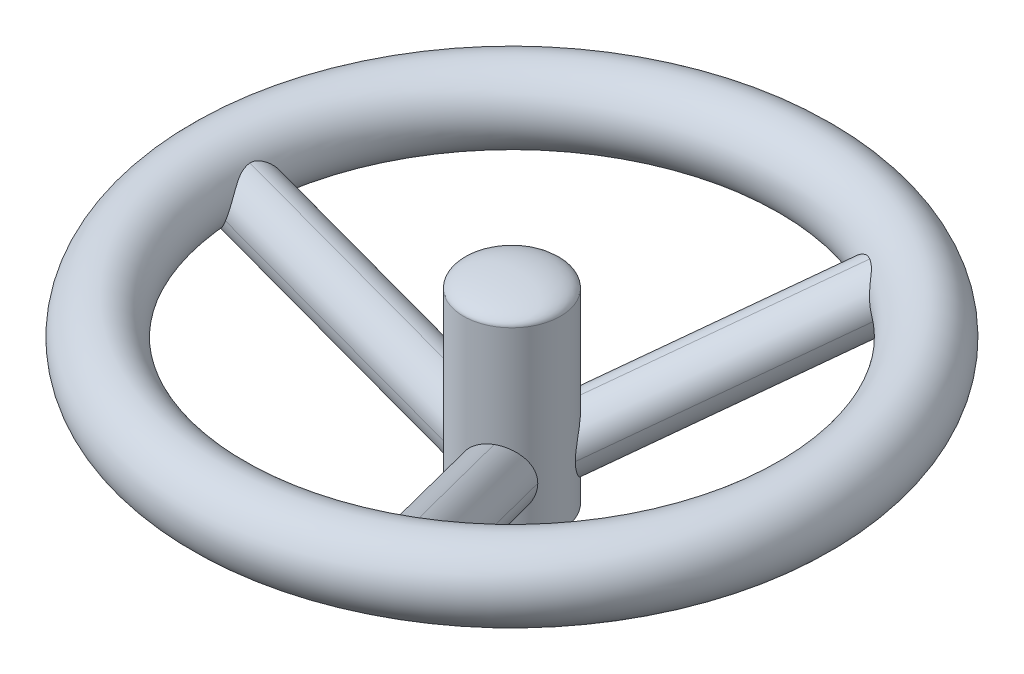
ISO-10303-21;
HEADER;
FILE_DESCRIPTION(('STEP AP214'),'2;1');
FILE_NAME('part.step','',(''),(''),'','','');
FILE_SCHEMA(('AUTOMOTIVE_DESIGN { 1 0 10303 214 1 1 1 1 }'));
ENDSEC;
DATA;
#1=APPLICATION_CONTEXT('core data for automotive mechanical design processes');
#2=APPLICATION_PROTOCOL_DEFINITION('international standard','automotive_design',2000,#1);
#3=PRODUCT_CONTEXT('',#1,'mechanical');
#4=PRODUCT('Part','Part','',(#3));
#5=PRODUCT_RELATED_PRODUCT_CATEGORY('part','',(#4));
#6=PRODUCT_DEFINITION_FORMATION('','',#4);
#7=PRODUCT_DEFINITION_CONTEXT('part definition',#1,'design');
#8=PRODUCT_DEFINITION('design','',#6,#7);
#9=PRODUCT_DEFINITION_SHAPE('','',#8);
#10=(LENGTH_UNIT() NAMED_UNIT(*) SI_UNIT(.MILLI.,.METRE.));
#11=(NAMED_UNIT(*) PLANE_ANGLE_UNIT() SI_UNIT($,.RADIAN.));
#12=(NAMED_UNIT(*) SI_UNIT($,.STERADIAN.) SOLID_ANGLE_UNIT());
#13=UNCERTAINTY_MEASURE_WITH_UNIT(LENGTH_MEASURE(1.E-05),#10,'distance_accuracy_value','');
#14=(GEOMETRIC_REPRESENTATION_CONTEXT(3) GLOBAL_UNCERTAINTY_ASSIGNED_CONTEXT((#13)) GLOBAL_UNIT_ASSIGNED_CONTEXT((#10,
#11,#12)) REPRESENTATION_CONTEXT('',''));
#15=CARTESIAN_POINT('',(0.,0.,0.));
#16=DIRECTION('',(0.,0.,1.));
#17=DIRECTION('',(1.,0.,0.));
#18=AXIS2_PLACEMENT_3D('',#15,#16,#17);
#19=CARTESIAN_POINT('',(79.1831013105577,18.7376895775405,177.149154570763));
#20=DIRECTION('',(0.468442239438506,0.349639061375189,0.811365759118855));
#21=DIRECTION('',(0.174819530687591,-0.936884478877026,0.302796309306261));
#22=AXIS2_PLACEMENT_3D('',#19,#20,#21);
#23=PLANE('',#22);
#24=CARTESIAN_POINT('',(99.9999999999984,0.,173.205080756889));
#25=DIRECTION('',(0.468442239438506,0.349639061375189,0.811365759118855));
#26=DIRECTION('',(0.174819530687591,-0.936884478877026,0.302796309306261));
#27=AXIS2_PLACEMENT_3D('',#24,#25,#26);
#28=CIRCLE('',#27,20.);
#29=CARTESIAN_POINT('',(117.320508075687,0.,163.205080756889));
#30=VERTEX_POINT('',#29);
#31=CARTESIAN_POINT('',(96.5036093862466,18.7376895775405,167.149154570763));
#32=VERTEX_POINT('',#31);
#33=EDGE_CURVE('E105',#30,#32,#28,.T.);
#34=ORIENTED_EDGE('',*,*,#33,.T.);
#35=CARTESIAN_POINT('',(99.9999999999984,0.,173.205080756889));
#36=DIRECTION('',(0.468442239438506,0.349639061375189,0.811365759118855));
#37=DIRECTION('',(0.174819530687591,-0.936884478877026,0.302796309306261));
#38=AXIS2_PLACEMENT_3D('',#35,#36,#37);
#39=CIRCLE('',#38,20.);
#40=CARTESIAN_POINT('',(82.6794919243095,0.,183.205080756889));
#41=VERTEX_POINT('',#40);
#42=EDGE_CURVE('E56',#32,#41,#39,.T.);
#43=ORIENTED_EDGE('',*,*,#42,.T.);
#44=CARTESIAN_POINT('',(99.9999999999984,0.,173.205080756889));
#45=DIRECTION('',(0.468442239438506,0.349639061375189,0.811365759118855));
#46=DIRECTION('',(0.174819530687591,-0.936884478877026,0.302796309306261));
#47=AXIS2_PLACEMENT_3D('',#44,#45,#46);
#48=CIRCLE('',#47,20.);
#49=CARTESIAN_POINT('',(103.49639061375,-18.7376895775405,179.261006943014));
#50=VERTEX_POINT('',#49);
#51=EDGE_CURVE('E103',#41,#50,#48,.T.);
#52=ORIENTED_EDGE('',*,*,#51,.T.);
#53=CARTESIAN_POINT('',(99.9999999999984,0.,173.205080756889));
#54=DIRECTION('',(0.468442239438506,0.349639061375189,0.811365759118855));
#55=DIRECTION('',(0.174819530687591,-0.936884478877026,0.302796309306261));
#56=AXIS2_PLACEMENT_3D('',#53,#54,#55);
#57=CIRCLE('',#56,20.);
#58=EDGE_CURVE('E69',#50,#30,#57,.T.);
#59=ORIENTED_EDGE('',*,*,#58,.T.);
#60=EDGE_LOOP('',(#34,#43,#52,#59));
#61=FACE_BOUND('',#60,.T.);
#62=ADVANCED_FACE('F48',(#61),#23,.T.);
#63=CARTESIAN_POINT('',(-14.6172712476637,-51.2736617839647,14.6821435310308));
#64=DIRECTION('',(-0.468442239438506,-0.349639061375189,-0.811365759118855));
#65=DIRECTION('',(-0.174819530687592,0.936884478877026,-0.302796309306262));
#66=AXIS2_PLACEMENT_3D('',#63,#64,#65);
#67=PLANE('',#66);
#68=CARTESIAN_POINT('',(6.19962744177695,-70.0113513615052,10.7380697171562));
#69=DIRECTION('',(-0.468442239438506,-0.349639061375189,-0.811365759118855));
#70=DIRECTION('',(-0.174819530687592,0.936884478877026,-0.302796309306262));
#71=AXIS2_PLACEMENT_3D('',#68,#69,#70);
#72=CIRCLE('',#71,20.);
#73=CARTESIAN_POINT('',(9.69601805552878,-88.7490409390457,16.7939959032814));
#74=VERTEX_POINT('',#73);
#75=CARTESIAN_POINT('',(-11.1208806339119,-70.0113513615052,20.738069717156));
#76=VERTEX_POINT('',#75);
#77=EDGE_CURVE('E92',#74,#76,#72,.T.);
#78=ORIENTED_EDGE('',*,*,#77,.T.);
#79=CARTESIAN_POINT('',(6.19962744177696,-70.0113513615052,10.7380697171562));
#80=DIRECTION('',(-0.468442239438506,-0.349639061375189,-0.811365759118855));
#81=DIRECTION('',(-0.174819530687592,0.936884478877026,-0.302796309306262));
#82=AXIS2_PLACEMENT_3D('',#79,#80,#81);
#83=CIRCLE('',#82,20.);
#84=CARTESIAN_POINT('',(2.70323682802512,-51.2736617839647,4.68214353103094));
#85=VERTEX_POINT('',#84);
#86=EDGE_CURVE('E12',#76,#85,#83,.T.);
#87=ORIENTED_EDGE('',*,*,#86,.T.);
#88=CARTESIAN_POINT('',(6.19962744177696,-70.0113513615052,10.7380697171562));
#89=DIRECTION('',(-0.468442239438506,-0.349639061375189,-0.811365759118855));
#90=DIRECTION('',(-0.174819530687592,0.936884478877026,-0.302796309306262));
#91=AXIS2_PLACEMENT_3D('',#88,#89,#90);
#92=CIRCLE('',#91,20.);
#93=CARTESIAN_POINT('',(23.5201355174658,-70.0113513615052,0.738069717156328));
#94=VERTEX_POINT('',#93);
#95=EDGE_CURVE('E89',#85,#94,#92,.T.);
#96=ORIENTED_EDGE('',*,*,#95,.T.);
#97=CARTESIAN_POINT('',(6.19962744177695,-70.0113513615052,10.7380697171562));
#98=DIRECTION('',(-0.468442239438506,-0.349639061375189,-0.811365759118855));
#99=DIRECTION('',(-0.174819530687592,0.936884478877026,-0.302796309306262));
#100=AXIS2_PLACEMENT_3D('',#97,#98,#99);
#101=CIRCLE('',#100,20.);
#102=EDGE_CURVE('E101',#94,#74,#101,.T.);
#103=ORIENTED_EDGE('',*,*,#102,.T.);
#104=EDGE_LOOP('',(#78,#87,#96,#103));
#105=FACE_BOUND('',#104,.T.);
#106=ADVANCED_FACE('F88',(#105),#67,.T.);
#107=CARTESIAN_POINT('',(12.2247473239321,-65.5142819623093,21.1738834747425));
#108=DIRECTION('',(0.468442239438506,0.349639061375189,0.811365759118854));
#109=DIRECTION('',(0.174819530687592,-0.936884478877026,0.302796309306262));
#110=AXIS2_PLACEMENT_3D('',#107,#108,#109);
#111=CYLINDRICAL_SURFACE('',#110,20.);
#112=DIRECTION('',(0.468442239438506,0.349639061375189,0.811365759118854));
#113=VECTOR('',#112,1.);
#114=CARTESIAN_POINT('',(96.5036093862466,18.7376895775405,167.149154570763));
#115=LINE('',#114,#113);
#116=EDGE_CURVE('E97',#32,#85,#115,.F.);
#117=ORIENTED_EDGE('',*,*,#116,.F.);
#118=ORIENTED_EDGE('',*,*,#33,.F.);
#119=DIRECTION('',(0.468442239438506,0.349639061375189,0.811365759118854));
#120=VECTOR('',#119,1.);
#121=CARTESIAN_POINT('',(29.545255399621,-65.5142819623093,11.1738834747427));
#122=LINE('',#121,#120);
#123=EDGE_CURVE('E99',#94,#30,#122,.T.);
#124=ORIENTED_EDGE('',*,*,#123,.F.);
#125=ORIENTED_EDGE('',*,*,#95,.F.);
#126=EDGE_LOOP('',(#117,#118,#124,#125));
#127=FACE_BOUND('',#126,.T.);
#128=ADVANCED_FACE('F96',(#127),#111,.T.);
#129=CARTESIAN_POINT('',(12.2247473239321,-65.5142819623093,21.1738834747425));
#130=DIRECTION('',(-0.468442239438506,-0.349639061375189,-0.811365759118854));
#131=DIRECTION('',(-0.174819530687592,0.936884478877026,-0.302796309306262));
#132=AXIS2_PLACEMENT_3D('',#129,#130,#131);
#133=CYLINDRICAL_SURFACE('',#132,20.);
#134=ORIENTED_EDGE('',*,*,#123,.T.);
#135=ORIENTED_EDGE('',*,*,#58,.F.);
#136=DIRECTION('',(-0.468442239438506,-0.349639061375189,-0.811365759118854));
#137=VECTOR('',#136,1.);
#138=CARTESIAN_POINT('',(9.69601805552878,-88.7490409390457,16.7939959032814));
#139=LINE('',#138,#137);
#140=EDGE_CURVE('E109',#74,#50,#139,.F.);
#141=ORIENTED_EDGE('',*,*,#140,.F.);
#142=ORIENTED_EDGE('',*,*,#102,.F.);
#143=EDGE_LOOP('',(#134,#135,#141,#142));
#144=FACE_BOUND('',#143,.T.);
#145=ADVANCED_FACE('F122',(#144),#133,.T.);
#146=CARTESIAN_POINT('',(6.19962744177695,-70.0113513615052,10.7380697171562));
#147=DIRECTION('',(0.468442239438506,0.349639061375189,0.811365759118854));
#148=DIRECTION('',(0.174819530687592,-0.936884478877026,0.302796309306262));
#149=AXIS2_PLACEMENT_3D('',#146,#147,#148);
#150=CYLINDRICAL_SURFACE('',#149,20.);
#151=ORIENTED_EDGE('',*,*,#51,.F.);
#152=DIRECTION('',(-0.468442239438506,-0.349639061375189,-0.811365759118854));
#153=VECTOR('',#152,1.);
#154=CARTESIAN_POINT('',(82.6794919243095,0.,183.205080756888));
#155=LINE('',#154,#153);
#156=EDGE_CURVE('E117',#76,#41,#155,.F.);
#157=ORIENTED_EDGE('',*,*,#156,.F.);
#158=ORIENTED_EDGE('',*,*,#77,.F.);
#159=ORIENTED_EDGE('',*,*,#140,.T.);
#160=EDGE_LOOP('',(#151,#157,#158,#159));
#161=FACE_BOUND('',#160,.T.);
#162=ADVANCED_FACE('F121',(#161),#150,.T.);
#163=CARTESIAN_POINT('',(99.9999999999984,0.,173.205080756889));
#164=DIRECTION('',(-0.468442239438506,-0.349639061375189,-0.811365759118854));
#165=DIRECTION('',(-0.174819530687592,0.936884478877026,-0.302796309306262));
#166=AXIS2_PLACEMENT_3D('',#163,#164,#165);
#167=CYLINDRICAL_SURFACE('',#166,20.);
#168=ORIENTED_EDGE('',*,*,#86,.F.);
#169=ORIENTED_EDGE('',*,*,#156,.T.);
#170=ORIENTED_EDGE('',*,*,#42,.F.);
#171=ORIENTED_EDGE('',*,*,#116,.T.);
#172=EDGE_LOOP('',(#168,#169,#170,#171));
#173=FACE_BOUND('',#172,.T.);
#174=ADVANCED_FACE('F50',(#173),#167,.T.);
#175=CLOSED_SHELL('',(#62,#106,#128,#145,#162,#174));
#176=MANIFOLD_SOLID_BREP('B2',#175);
#177=CARTESIAN_POINT('',(113.824117461938,18.7376895775405,-157.149154570762));
#178=DIRECTION('',(0.468442239438517,0.349639061375189,-0.811365759118848));
#179=DIRECTION('',(0.174819530687596,-0.936884478877026,-0.302796309306259));
#180=AXIS2_PLACEMENT_3D('',#177,#178,#179);
#181=PLANE('',#180);
#182=CARTESIAN_POINT('',(100.000000000001,0.,-173.205080756887));
#183=DIRECTION('',(0.468442239438517,0.349639061375189,-0.811365759118848));
#184=DIRECTION('',(0.174819530687596,-0.936884478877026,-0.302796309306259));
#185=AXIS2_PLACEMENT_3D('',#182,#183,#184);
#186=CIRCLE('',#185,20.);
#187=CARTESIAN_POINT('',(82.6794919243121,0.,-183.205080756887));
#188=VERTEX_POINT('',#187);
#189=CARTESIAN_POINT('',(96.5036093862489,18.7376895775405,-167.149154570762));
#190=VERTEX_POINT('',#189);
#191=EDGE_CURVE('E239',#188,#190,#186,.T.);
#192=ORIENTED_EDGE('',*,*,#191,.T.);
#193=CARTESIAN_POINT('',(100.000000000001,0.,-173.205080756887));
#194=DIRECTION('',(0.468442239438517,0.349639061375189,-0.811365759118848));
#195=DIRECTION('',(0.174819530687596,-0.936884478877026,-0.302796309306259));
#196=AXIS2_PLACEMENT_3D('',#193,#194,#195);
#197=CIRCLE('',#196,20.);
#198=CARTESIAN_POINT('',(117.32050807569,0.,-163.205080756887));
#199=VERTEX_POINT('',#198);
#200=EDGE_CURVE('E190',#190,#199,#197,.T.);
#201=ORIENTED_EDGE('',*,*,#200,.T.);
#202=CARTESIAN_POINT('',(100.000000000001,0.,-173.205080756887));
#203=DIRECTION('',(0.468442239438517,0.349639061375189,-0.811365759118848));
#204=DIRECTION('',(0.174819530687596,-0.936884478877026,-0.302796309306259));
#205=AXIS2_PLACEMENT_3D('',#202,#203,#204);
#206=CIRCLE('',#205,20.);
#207=CARTESIAN_POINT('',(103.496390613753,-18.7376895775405,-179.261006943012));
#208=VERTEX_POINT('',#207);
#209=EDGE_CURVE('E237',#199,#208,#206,.T.);
#210=ORIENTED_EDGE('',*,*,#209,.T.);
#211=CARTESIAN_POINT('',(100.000000000001,0.,-173.205080756887));
#212=DIRECTION('',(0.468442239438517,0.349639061375189,-0.811365759118848));
#213=DIRECTION('',(0.174819530687596,-0.936884478877026,-0.302796309306259));
#214=AXIS2_PLACEMENT_3D('',#211,#212,#213);
#215=CIRCLE('',#214,20.);
#216=EDGE_CURVE('E203',#208,#188,#215,.T.);
#217=ORIENTED_EDGE('',*,*,#216,.T.);
#218=EDGE_LOOP('',(#192,#201,#210,#217));
#219=FACE_BOUND('',#218,.T.);
#220=ADVANCED_FACE('F182',(#219),#181,.T.);
#221=CARTESIAN_POINT('',(20.0237449037139,-51.2736617839647,5.31785646896918));
#222=DIRECTION('',(-0.468442239438517,-0.349639061375189,0.811365759118848));
#223=DIRECTION('',(-0.174819530687596,0.936884478877026,0.302796309306259));
#224=AXIS2_PLACEMENT_3D('',#221,#222,#223);
#225=PLANE('',#224);
#226=CARTESIAN_POINT('',(6.1996274417771,-70.0113513615052,-10.7380697171561));
#227=DIRECTION('',(-0.468442239438517,-0.349639061375189,0.811365759118848));
#228=DIRECTION('',(-0.174819530687596,0.936884478877026,0.302796309306259));
#229=AXIS2_PLACEMENT_3D('',#226,#227,#228);
#230=CIRCLE('',#229,20.);
#231=CARTESIAN_POINT('',(9.69601805552902,-88.7490409390457,-16.7939959032813));
#232=VERTEX_POINT('',#231);
#233=CARTESIAN_POINT('',(23.5201355174658,-70.0113513615052,-0.738069717155995));
#234=VERTEX_POINT('',#233);
#235=EDGE_CURVE('E226',#232,#234,#230,.T.);
#236=ORIENTED_EDGE('',*,*,#235,.T.);
#237=CARTESIAN_POINT('',(6.19962744177711,-70.0113513615052,-10.7380697171561));
#238=DIRECTION('',(-0.468442239438517,-0.349639061375189,0.811365759118848));
#239=DIRECTION('',(-0.174819530687596,0.936884478877026,0.302796309306259));
#240=AXIS2_PLACEMENT_3D('',#237,#238,#239);
#241=CIRCLE('',#240,20.);
#242=CARTESIAN_POINT('',(2.70323682802519,-51.2736617839647,-4.6821435310309));
#243=VERTEX_POINT('',#242);
#244=EDGE_CURVE('E46',#234,#243,#241,.T.);
#245=ORIENTED_EDGE('',*,*,#244,.T.);
#246=CARTESIAN_POINT('',(6.19962744177711,-70.0113513615052,-10.7380697171561));
#247=DIRECTION('',(-0.468442239438517,-0.349639061375189,0.811365759118848));
#248=DIRECTION('',(-0.174819530687596,0.936884478877026,0.302796309306259));
#249=AXIS2_PLACEMENT_3D('',#246,#247,#248);
#250=CIRCLE('',#249,20.);
#251=CARTESIAN_POINT('',(-11.1208806339116,-70.0113513615052,-20.7380697171562));
#252=VERTEX_POINT('',#251);
#253=EDGE_CURVE('E223',#243,#252,#250,.T.);
#254=ORIENTED_EDGE('',*,*,#253,.T.);
#255=CARTESIAN_POINT('',(6.1996274417771,-70.0113513615052,-10.7380697171561));
#256=DIRECTION('',(-0.468442239438517,-0.349639061375189,0.811365759118848));
#257=DIRECTION('',(-0.174819530687596,0.936884478877026,0.302796309306259));
#258=AXIS2_PLACEMENT_3D('',#255,#256,#257);
#259=CIRCLE('',#258,20.);
#260=EDGE_CURVE('E235',#252,#232,#259,.T.);
#261=ORIENTED_EDGE('',*,*,#260,.T.);
#262=EDGE_LOOP('',(#236,#245,#254,#261));
#263=FACE_BOUND('',#262,.T.);
#264=ADVANCED_FACE('F222',(#263),#225,.T.);
#265=CARTESIAN_POINT('',(12.2247473239324,-65.5142819623093,-21.1738834747424));
#266=DIRECTION('',(0.468442239438517,0.349639061375189,-0.811365759118848));
#267=DIRECTION('',(0.174819530687596,-0.936884478877026,-0.302796309306259));
#268=AXIS2_PLACEMENT_3D('',#265,#266,#267);
#269=CYLINDRICAL_SURFACE('',#268,20.);
#270=DIRECTION('',(0.468442239438517,0.349639061375189,-0.811365759118848));
#271=VECTOR('',#270,1.);
#272=CARTESIAN_POINT('',(96.5036093862489,18.7376895775405,-167.149154570762));
#273=LINE('',#272,#271);
#274=EDGE_CURVE('E231',#190,#243,#273,.F.);
#275=ORIENTED_EDGE('',*,*,#274,.F.);
#276=ORIENTED_EDGE('',*,*,#191,.F.);
#277=DIRECTION('',(0.468442239438517,0.349639061375189,-0.811365759118848));
#278=VECTOR('',#277,1.);
#279=CARTESIAN_POINT('',(-5.09576075175632,-65.5142819623093,-31.1738834747425));
#280=LINE('',#279,#278);
#281=EDGE_CURVE('E233',#252,#188,#280,.T.);
#282=ORIENTED_EDGE('',*,*,#281,.F.);
#283=ORIENTED_EDGE('',*,*,#253,.F.);
#284=EDGE_LOOP('',(#275,#276,#282,#283));
#285=FACE_BOUND('',#284,.T.);
#286=ADVANCED_FACE('F230',(#285),#269,.T.);
#287=CARTESIAN_POINT('',(12.2247473239324,-65.5142819623093,-21.1738834747424));
#288=DIRECTION('',(-0.468442239438517,-0.349639061375189,0.811365759118848));
#289=DIRECTION('',(-0.174819530687596,0.936884478877026,0.302796309306259));
#290=AXIS2_PLACEMENT_3D('',#287,#288,#289);
#291=CYLINDRICAL_SURFACE('',#290,20.);
#292=ORIENTED_EDGE('',*,*,#281,.T.);
#293=ORIENTED_EDGE('',*,*,#216,.F.);
#294=DIRECTION('',(-0.468442239438517,-0.349639061375189,0.811365759118848));
#295=VECTOR('',#294,1.);
#296=CARTESIAN_POINT('',(9.69601805552902,-88.7490409390457,-16.7939959032813));
#297=LINE('',#296,#295);
#298=EDGE_CURVE('E243',#232,#208,#297,.F.);
#299=ORIENTED_EDGE('',*,*,#298,.F.);
#300=ORIENTED_EDGE('',*,*,#260,.F.);
#301=EDGE_LOOP('',(#292,#293,#299,#300));
#302=FACE_BOUND('',#301,.T.);
#303=ADVANCED_FACE('F256',(#302),#291,.T.);
#304=CARTESIAN_POINT('',(6.1996274417771,-70.0113513615052,-10.7380697171561));
#305=DIRECTION('',(0.468442239438517,0.349639061375189,-0.811365759118848));
#306=DIRECTION('',(0.174819530687596,-0.936884478877026,-0.302796309306259));
#307=AXIS2_PLACEMENT_3D('',#304,#305,#306);
#308=CYLINDRICAL_SURFACE('',#307,20.);
#309=ORIENTED_EDGE('',*,*,#209,.F.);
#310=DIRECTION('',(-0.468442239438517,-0.349639061375189,0.811365759118848));
#311=VECTOR('',#310,1.);
#312=CARTESIAN_POINT('',(117.32050807569,0.,-163.205080756887));
#313=LINE('',#312,#311);
#314=EDGE_CURVE('E251',#234,#199,#313,.F.);
#315=ORIENTED_EDGE('',*,*,#314,.F.);
#316=ORIENTED_EDGE('',*,*,#235,.F.);
#317=ORIENTED_EDGE('',*,*,#298,.T.);
#318=EDGE_LOOP('',(#309,#315,#316,#317));
#319=FACE_BOUND('',#318,.T.);
#320=ADVANCED_FACE('F255',(#319),#308,.T.);
#321=CARTESIAN_POINT('',(100.000000000001,0.,-173.205080756887));
#322=DIRECTION('',(-0.468442239438517,-0.349639061375189,0.811365759118848));
#323=DIRECTION('',(-0.174819530687596,0.936884478877026,0.302796309306259));
#324=AXIS2_PLACEMENT_3D('',#321,#322,#323);
#325=CYLINDRICAL_SURFACE('',#324,20.);
#326=ORIENTED_EDGE('',*,*,#244,.F.);
#327=ORIENTED_EDGE('',*,*,#314,.T.);
#328=ORIENTED_EDGE('',*,*,#200,.F.);
#329=ORIENTED_EDGE('',*,*,#274,.T.);
#330=EDGE_LOOP('',(#326,#327,#328,#329));
#331=FACE_BOUND('',#330,.T.);
#332=ADVANCED_FACE('F184',(#331),#325,.T.);
#333=CLOSED_SHELL('',(#220,#264,#286,#303,#320,#332));
#334=MANIFOLD_SOLID_BREP('B6',#333);
#335=CARTESIAN_POINT('',(-193.007218772496,18.7376895775405,-20.));
#336=DIRECTION('',(-0.936884478877026,0.349639061375189,0.));
#337=DIRECTION('',(-0.349639061375189,-0.936884478877026,0.));
#338=AXIS2_PLACEMENT_3D('',#335,#336,#337);
#339=PLANE('',#338);
#340=CARTESIAN_POINT('',(-200.,0.,0.));
#341=DIRECTION('',(-0.936884478877026,0.349639061375189,0.));
#342=DIRECTION('',(-0.349639061375189,-0.936884478877026,0.));
#343=AXIS2_PLACEMENT_3D('',#340,#341,#342);
#344=CIRCLE('',#343,20.);
#345=CARTESIAN_POINT('',(-200.,0.,20.));
#346=VERTEX_POINT('',#345);
#347=CARTESIAN_POINT('',(-193.007218772496,18.7376895775405,0.));
#348=VERTEX_POINT('',#347);
#349=EDGE_CURVE('E369',#346,#348,#344,.T.);
#350=ORIENTED_EDGE('',*,*,#349,.T.);
#351=CARTESIAN_POINT('',(-200.,0.,0.));
#352=DIRECTION('',(-0.936884478877026,0.349639061375189,0.));
#353=DIRECTION('',(-0.349639061375189,-0.936884478877026,0.));
#354=AXIS2_PLACEMENT_3D('',#351,#352,#353);
#355=CIRCLE('',#354,20.);
#356=CARTESIAN_POINT('',(-200.,0.,-20.));
#357=VERTEX_POINT('',#356);
#358=EDGE_CURVE('E320',#348,#357,#355,.T.);
#359=ORIENTED_EDGE('',*,*,#358,.T.);
#360=CARTESIAN_POINT('',(-200.,0.,0.));
#361=DIRECTION('',(-0.936884478877026,0.349639061375189,0.));
#362=DIRECTION('',(-0.349639061375189,-0.936884478877026,0.));
#363=AXIS2_PLACEMENT_3D('',#360,#361,#362);
#364=CIRCLE('',#363,20.);
#365=CARTESIAN_POINT('',(-206.992781227504,-18.7376895775405,0.));
#366=VERTEX_POINT('',#365);
#367=EDGE_CURVE('E367',#357,#366,#364,.T.);
#368=ORIENTED_EDGE('',*,*,#367,.T.);
#369=CARTESIAN_POINT('',(-200.,0.,0.));
#370=DIRECTION('',(-0.936884478877026,0.349639061375189,0.));
#371=DIRECTION('',(-0.349639061375189,-0.936884478877026,0.));
#372=AXIS2_PLACEMENT_3D('',#369,#370,#371);
#373=CIRCLE('',#372,20.);
#374=EDGE_CURVE('E333',#366,#346,#373,.T.);
#375=ORIENTED_EDGE('',*,*,#374,.T.);
#376=EDGE_LOOP('',(#350,#359,#368,#375));
#377=FACE_BOUND('',#376,.T.);
#378=ADVANCED_FACE('F312',(#377),#339,.T.);
#379=CARTESIAN_POINT('',(-5.40647365605033,-51.2736617839647,-20.));
#380=DIRECTION('',(0.936884478877026,-0.349639061375189,0.));
#381=DIRECTION('',(0.349639061375189,0.936884478877026,0.));
#382=AXIS2_PLACEMENT_3D('',#379,#380,#381);
#383=PLANE('',#382);
#384=CARTESIAN_POINT('',(-12.3992548835541,-70.0113513615052,0.));
#385=DIRECTION('',(0.936884478877026,-0.349639061375189,0.));
#386=DIRECTION('',(0.349639061375189,0.936884478877026,0.));
#387=AXIS2_PLACEMENT_3D('',#384,#385,#386);
#388=CIRCLE('',#387,20.);
#389=CARTESIAN_POINT('',(-19.3920361110579,-88.7490409390457,0.));
#390=VERTEX_POINT('',#389);
#391=CARTESIAN_POINT('',(-12.3992548835541,-70.0113513615052,-20.));
#392=VERTEX_POINT('',#391);
#393=EDGE_CURVE('E356',#390,#392,#388,.T.);
#394=ORIENTED_EDGE('',*,*,#393,.T.);
#395=CARTESIAN_POINT('',(-12.3992548835541,-70.0113513615052,0.));
#396=DIRECTION('',(0.936884478877026,-0.349639061375189,0.));
#397=DIRECTION('',(0.349639061375189,0.936884478877026,0.));
#398=AXIS2_PLACEMENT_3D('',#395,#396,#397);
#399=CIRCLE('',#398,20.);
#400=CARTESIAN_POINT('',(-5.40647365605033,-51.2736617839647,0.));
#401=VERTEX_POINT('',#400);
#402=EDGE_CURVE('E180',#392,#401,#399,.T.);
#403=ORIENTED_EDGE('',*,*,#402,.T.);
#404=CARTESIAN_POINT('',(-12.3992548835541,-70.0113513615052,0.));
#405=DIRECTION('',(0.936884478877026,-0.349639061375189,0.));
#406=DIRECTION('',(0.349639061375189,0.936884478877026,0.));
#407=AXIS2_PLACEMENT_3D('',#404,#405,#406);
#408=CIRCLE('',#407,20.);
#409=CARTESIAN_POINT('',(-12.3992548835541,-70.0113513615052,20.));
#410=VERTEX_POINT('',#409);
#411=EDGE_CURVE('E353',#401,#410,#408,.T.);
#412=ORIENTED_EDGE('',*,*,#411,.T.);
#413=CARTESIAN_POINT('',(-12.3992548835541,-70.0113513615052,0.));
#414=DIRECTION('',(0.936884478877026,-0.349639061375189,0.));
#415=DIRECTION('',(0.349639061375189,0.936884478877026,0.));
#416=AXIS2_PLACEMENT_3D('',#413,#414,#415);
#417=CIRCLE('',#416,20.);
#418=EDGE_CURVE('E365',#410,#390,#417,.T.);
#419=ORIENTED_EDGE('',*,*,#418,.T.);
#420=EDGE_LOOP('',(#394,#403,#412,#419));
#421=FACE_BOUND('',#420,.T.);
#422=ADVANCED_FACE('F352',(#421),#383,.T.);
#423=CARTESIAN_POINT('',(-24.4494946478646,-65.5142819623093,0.));
#424=DIRECTION('',(-0.936884478877026,0.349639061375189,0.));
#425=DIRECTION('',(-0.349639061375189,-0.936884478877026,0.));
#426=AXIS2_PLACEMENT_3D('',#423,#424,#425);
#427=CYLINDRICAL_SURFACE('',#426,20.);
#428=DIRECTION('',(-0.936884478877026,0.349639061375189,0.));
#429=VECTOR('',#428,1.);
#430=CARTESIAN_POINT('',(-193.007218772496,18.7376895775405,0.));
#431=LINE('',#430,#429);
#432=EDGE_CURVE('E361',#348,#401,#431,.F.);
#433=ORIENTED_EDGE('',*,*,#432,.F.);
#434=ORIENTED_EDGE('',*,*,#349,.F.);
#435=DIRECTION('',(-0.936884478877026,0.349639061375189,0.));
#436=VECTOR('',#435,1.);
#437=CARTESIAN_POINT('',(-24.4494946478646,-65.5142819623093,20.));
#438=LINE('',#437,#436);
#439=EDGE_CURVE('E363',#410,#346,#438,.T.);
#440=ORIENTED_EDGE('',*,*,#439,.F.);
#441=ORIENTED_EDGE('',*,*,#411,.F.);
#442=EDGE_LOOP('',(#433,#434,#440,#441));
#443=FACE_BOUND('',#442,.T.);
#444=ADVANCED_FACE('F360',(#443),#427,.T.);
#445=CARTESIAN_POINT('',(-24.4494946478646,-65.5142819623093,0.));
#446=DIRECTION('',(0.936884478877026,-0.349639061375189,0.));
#447=DIRECTION('',(0.349639061375189,0.936884478877026,0.));
#448=AXIS2_PLACEMENT_3D('',#445,#446,#447);
#449=CYLINDRICAL_SURFACE('',#448,20.);
#450=ORIENTED_EDGE('',*,*,#439,.T.);
#451=ORIENTED_EDGE('',*,*,#374,.F.);
#452=DIRECTION('',(0.936884478877026,-0.349639061375189,0.));
#453=VECTOR('',#452,1.);
#454=CARTESIAN_POINT('',(-19.3920361110579,-88.7490409390457,0.));
#455=LINE('',#454,#453);
#456=EDGE_CURVE('E373',#390,#366,#455,.F.);
#457=ORIENTED_EDGE('',*,*,#456,.F.);
#458=ORIENTED_EDGE('',*,*,#418,.F.);
#459=EDGE_LOOP('',(#450,#451,#457,#458));
#460=FACE_BOUND('',#459,.T.);
#461=ADVANCED_FACE('F386',(#460),#449,.T.);
#462=CARTESIAN_POINT('',(-12.3992548835541,-70.0113513615052,0.));
#463=DIRECTION('',(-0.936884478877026,0.349639061375189,0.));
#464=DIRECTION('',(-0.349639061375189,-0.936884478877026,0.));
#465=AXIS2_PLACEMENT_3D('',#462,#463,#464);
#466=CYLINDRICAL_SURFACE('',#465,20.);
#467=ORIENTED_EDGE('',*,*,#367,.F.);
#468=DIRECTION('',(0.936884478877026,-0.349639061375189,0.));
#469=VECTOR('',#468,1.);
#470=CARTESIAN_POINT('',(-200.,0.,-20.));
#471=LINE('',#470,#469);
#472=EDGE_CURVE('E381',#392,#357,#471,.F.);
#473=ORIENTED_EDGE('',*,*,#472,.F.);
#474=ORIENTED_EDGE('',*,*,#393,.F.);
#475=ORIENTED_EDGE('',*,*,#456,.T.);
#476=EDGE_LOOP('',(#467,#473,#474,#475));
#477=FACE_BOUND('',#476,.T.);
#478=ADVANCED_FACE('F385',(#477),#466,.T.);
#479=CARTESIAN_POINT('',(-200.,0.,0.));
#480=DIRECTION('',(0.936884478877026,-0.349639061375189,0.));
#481=DIRECTION('',(0.349639061375189,0.936884478877026,0.));
#482=AXIS2_PLACEMENT_3D('',#479,#480,#481);
#483=CYLINDRICAL_SURFACE('',#482,20.);
#484=ORIENTED_EDGE('',*,*,#402,.F.);
#485=ORIENTED_EDGE('',*,*,#472,.T.);
#486=ORIENTED_EDGE('',*,*,#358,.F.);
#487=ORIENTED_EDGE('',*,*,#432,.T.);
#488=EDGE_LOOP('',(#484,#485,#486,#487));
#489=FACE_BOUND('',#488,.T.);
#490=ADVANCED_FACE('F314',(#489),#483,.T.);
#491=CLOSED_SHELL('',(#378,#422,#444,#461,#478,#490));
#492=MANIFOLD_SOLID_BREP('B40',#491);
#493=CARTESIAN_POINT('',(0.,0.,0.));
#494=DIRECTION('',(0.,-1.,0.));
#495=DIRECTION('',(0.,0.,-1.));
#496=AXIS2_PLACEMENT_3D('',#493,#494,#495);
#497=TOROIDAL_SURFACE('',#496,200.,25.);
#498=CARTESIAN_POINT('',(0.,0.,-225.));
#499=VERTEX_POINT('',#498);
#500=VERTEX_LOOP('',#499);
#501=FACE_BOUND('',#500,.T.);
#502=ADVANCED_FACE('F445',(#501),#497,.T.);
#503=CLOSED_SHELL('',(#502));
#504=MANIFOLD_SOLID_BREP('B174',#503);
#505=CARTESIAN_POINT('',(0.,28.8435486202202,0.));
#506=DIRECTION('',(-1.,0.,0.));
#507=DIRECTION('',(0.,0.,-1.));
#508=AXIS2_PLACEMENT_3D('',#505,#506,#507);
#509=ELLIPSE('',#508,33.1270505452383,10.);
#510=TRIMMED_CURVE('',#509,(PARAMETER_VALUE(4.71238898038469)),
(PARAMETER_VALUE(7.85398163397448)),.T.,.PARAMETER.);
#511=CARTESIAN_POINT('',(0.,18.8435486202201,0.));
#512=DIRECTION('',(0.,1.,0.));
#513=AXIS1_PLACEMENT('',#511,#512);
#514=SURFACE_OF_REVOLUTION('',#510,#513);
#515=CARTESIAN_POINT('',(0.,38.8435486202202,0.));
#516=VERTEX_POINT('',#515);
#517=VERTEX_LOOP('',#516);
#518=FACE_BOUND('',#517,.T.);
#519=CARTESIAN_POINT('',(0.,28.8435486202202,0.));
#520=DIRECTION('',(0.,-1.,0.));
#521=DIRECTION('',(0.,0.,-1.));
#522=AXIS2_PLACEMENT_3D('',#519,#520,#521);
#523=CIRCLE('',#522,33.1270505452383);
#524=CARTESIAN_POINT('',(0.,28.8435486202202,-33.1270505452383));
#525=VERTEX_POINT('',#524);
#526=EDGE_CURVE('E443',#525,#525,#523,.T.);
#527=ORIENTED_EDGE('',*,*,#526,.F.);
#528=EDGE_LOOP('',(#527));
#529=FACE_BOUND('',#528,.T.);
#530=ADVANCED_FACE('F458',(#518,#529),#514,.F.);
#531=CARTESIAN_POINT('',(0.,-98.1317761169544,0.));
#532=DIRECTION('',(0.,-1.,0.));
#533=DIRECTION('',(0.,0.,-1.));
#534=AXIS2_PLACEMENT_3D('',#531,#532,#533);
#535=CYLINDRICAL_SURFACE('',#534,33.1270505452383);
#536=ORIENTED_EDGE('',*,*,#526,.T.);
#537=EDGE_LOOP('',(#536));
#538=FACE_BOUND('',#537,.T.);
#539=CARTESIAN_POINT('',(0.,-98.1317761169544,0.));
#540=DIRECTION('',(0.,-1.,0.));
#541=DIRECTION('',(0.,0.,-1.));
#542=AXIS2_PLACEMENT_3D('',#539,#540,#541);
#543=CIRCLE('',#542,33.1270505452383);
#544=CARTESIAN_POINT('',(0.,-98.1317761169544,-33.1270505452383));
#545=VERTEX_POINT('',#544);
#546=EDGE_CURVE('E465',#545,#545,#543,.T.);
#547=ORIENTED_EDGE('',*,*,#546,.F.);
#548=EDGE_LOOP('',(#547));
#549=FACE_BOUND('',#548,.T.);
#550=ADVANCED_FACE('F470',(#538,#549),#535,.T.);
#551=CARTESIAN_POINT('',(0.,-98.1317761169544,0.));
#552=DIRECTION('',(0.,-1.,0.));
#553=DIRECTION('',(0.,0.,-1.));
#554=AXIS2_PLACEMENT_3D('',#551,#552,#553);
#555=PLANE('',#554);
#556=ORIENTED_EDGE('',*,*,#546,.T.);
#557=EDGE_LOOP('',(#556));
#558=FACE_BOUND('',#557,.T.);
#559=ADVANCED_FACE('F475',(#558),#555,.T.);
#560=CLOSED_SHELL('',(#530,#550,#559));
#561=MANIFOLD_SOLID_BREP('B308',#560);
#562=ADVANCED_BREP_SHAPE_REPRESENTATION('',(#18,#176,#334,#492,#504,#561),#14);
#563=SHAPE_DEFINITION_REPRESENTATION(#9,#562);
ENDSEC;
END-ISO-10303-21;
